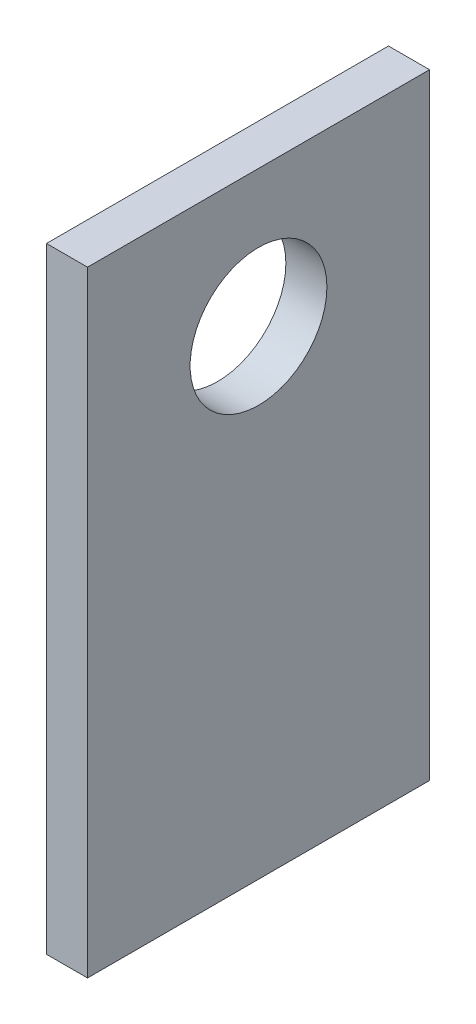
ISO-10303-21;
HEADER;
FILE_DESCRIPTION(('STEP AP214'),'2;1');
FILE_NAME('part.step','',(''),(''),'','','');
FILE_SCHEMA(('AUTOMOTIVE_DESIGN { 1 0 10303 214 1 1 1 1 }'));
ENDSEC;
DATA;
#1=APPLICATION_CONTEXT('core data for automotive mechanical design processes');
#2=APPLICATION_PROTOCOL_DEFINITION('international standard','automotive_design',2000,#1);
#3=PRODUCT_CONTEXT('',#1,'mechanical');
#4=PRODUCT('Part','Part','',(#3));
#5=PRODUCT_RELATED_PRODUCT_CATEGORY('part','',(#4));
#6=PRODUCT_DEFINITION_FORMATION('','',#4);
#7=PRODUCT_DEFINITION_CONTEXT('part definition',#1,'design');
#8=PRODUCT_DEFINITION('design','',#6,#7);
#9=PRODUCT_DEFINITION_SHAPE('','',#8);
#10=(LENGTH_UNIT() NAMED_UNIT(*) SI_UNIT(.MILLI.,.METRE.));
#11=(NAMED_UNIT(*) PLANE_ANGLE_UNIT() SI_UNIT($,.RADIAN.));
#12=(NAMED_UNIT(*) SI_UNIT($,.STERADIAN.) SOLID_ANGLE_UNIT());
#13=UNCERTAINTY_MEASURE_WITH_UNIT(LENGTH_MEASURE(1.E-05),#10,'distance_accuracy_value','');
#14=(GEOMETRIC_REPRESENTATION_CONTEXT(3) GLOBAL_UNCERTAINTY_ASSIGNED_CONTEXT((#13)) GLOBAL_UNIT_ASSIGNED_CONTEXT((#10,
#11,#12)) REPRESENTATION_CONTEXT('',''));
#15=CARTESIAN_POINT('',(0.,0.,0.));
#16=DIRECTION('',(0.,0.,1.));
#17=DIRECTION('',(1.,0.,0.));
#18=AXIS2_PLACEMENT_3D('',#15,#16,#17);
#19=CARTESIAN_POINT('',(3.,-22.5,-12.5));
#20=DIRECTION('',(0.,0.,1.));
#21=DIRECTION('',(1.,0.,0.));
#22=AXIS2_PLACEMENT_3D('',#19,#20,#21);
#23=PLANE('',#22);
#24=DIRECTION('',(0.,1.,0.));
#25=VECTOR('',#24,1.);
#26=CARTESIAN_POINT('',(0.,-22.5,-12.5));
#27=LINE('',#26,#25);
#28=CARTESIAN_POINT('',(0.,-22.5,-12.5));
#29=VERTEX_POINT('',#28);
#30=CARTESIAN_POINT('',(0.,22.5,-12.5));
#31=VERTEX_POINT('',#30);
#32=EDGE_CURVE('E97',#29,#31,#27,.T.);
#33=ORIENTED_EDGE('',*,*,#32,.T.);
#34=DIRECTION('',(-1.,0.,0.));
#35=VECTOR('',#34,1.);
#36=CARTESIAN_POINT('',(3.,22.5,-12.5));
#37=LINE('',#36,#35);
#38=CARTESIAN_POINT('',(3.,22.5,-12.5));
#39=VERTEX_POINT('',#38);
#40=EDGE_CURVE('E11',#39,#31,#37,.T.);
#41=ORIENTED_EDGE('',*,*,#40,.F.);
#42=DIRECTION('',(0.,1.,0.));
#43=VECTOR('',#42,1.);
#44=CARTESIAN_POINT('',(3.,-22.5,-12.5));
#45=LINE('',#44,#43);
#46=CARTESIAN_POINT('',(3.,-22.5,-12.5));
#47=VERTEX_POINT('',#46);
#48=EDGE_CURVE('E85',#47,#39,#45,.T.);
#49=ORIENTED_EDGE('',*,*,#48,.F.);
#50=DIRECTION('',(-1.,0.,0.));
#51=VECTOR('',#50,1.);
#52=CARTESIAN_POINT('',(3.,-22.5,-12.5));
#53=LINE('',#52,#51);
#54=EDGE_CURVE('E93',#47,#29,#53,.T.);
#55=ORIENTED_EDGE('',*,*,#54,.T.);
#56=EDGE_LOOP('',(#33,#41,#49,#55));
#57=FACE_BOUND('',#56,.T.);
#58=ADVANCED_FACE('F34',(#57),#23,.F.);
#59=CARTESIAN_POINT('',(3.,22.5,12.5));
#60=DIRECTION('',(0.,-1.,0.));
#61=DIRECTION('',(0.,0.,-1.));
#62=AXIS2_PLACEMENT_3D('',#59,#60,#61);
#63=PLANE('',#62);
#64=DIRECTION('',(0.,0.,1.));
#65=VECTOR('',#64,1.);
#66=CARTESIAN_POINT('',(0.,22.5,12.5));
#67=LINE('',#66,#65);
#68=CARTESIAN_POINT('',(0.,22.5,12.5));
#69=VERTEX_POINT('',#68);
#70=EDGE_CURVE('E89',#31,#69,#67,.T.);
#71=ORIENTED_EDGE('',*,*,#70,.T.);
#72=DIRECTION('',(-1.,0.,0.));
#73=VECTOR('',#72,1.);
#74=CARTESIAN_POINT('',(3.,22.5,12.5));
#75=LINE('',#74,#73);
#76=CARTESIAN_POINT('',(3.,22.5,12.5));
#77=VERTEX_POINT('',#76);
#78=EDGE_CURVE('E42',#77,#69,#75,.T.);
#79=ORIENTED_EDGE('',*,*,#78,.F.);
#80=DIRECTION('',(0.,0.,1.));
#81=VECTOR('',#80,1.);
#82=CARTESIAN_POINT('',(3.,22.5,12.5));
#83=LINE('',#82,#81);
#84=EDGE_CURVE('E80',#39,#77,#83,.T.);
#85=ORIENTED_EDGE('',*,*,#84,.F.);
#86=ORIENTED_EDGE('',*,*,#40,.T.);
#87=EDGE_LOOP('',(#71,#79,#85,#86));
#88=FACE_BOUND('',#87,.T.);
#89=ADVANCED_FACE('F88',(#88),#63,.F.);
#90=CARTESIAN_POINT('',(3.,-22.5,12.5));
#91=DIRECTION('',(0.,0.,-1.));
#92=DIRECTION('',(0.,1.,0.));
#93=AXIS2_PLACEMENT_3D('',#90,#91,#92);
#94=PLANE('',#93);
#95=DIRECTION('',(0.,-1.,0.));
#96=VECTOR('',#95,1.);
#97=CARTESIAN_POINT('',(0.,-22.5,12.5));
#98=LINE('',#97,#96);
#99=CARTESIAN_POINT('',(0.,-22.5,12.5));
#100=VERTEX_POINT('',#99);
#101=EDGE_CURVE('E67',#69,#100,#98,.T.);
#102=ORIENTED_EDGE('',*,*,#101,.T.);
#103=DIRECTION('',(-1.,0.,0.));
#104=VECTOR('',#103,1.);
#105=CARTESIAN_POINT('',(3.,-22.5,12.5));
#106=LINE('',#105,#104);
#107=CARTESIAN_POINT('',(3.,-22.5,12.5));
#108=VERTEX_POINT('',#107);
#109=EDGE_CURVE('E90',#108,#100,#106,.T.);
#110=ORIENTED_EDGE('',*,*,#109,.F.);
#111=DIRECTION('',(0.,-1.,0.));
#112=VECTOR('',#111,1.);
#113=CARTESIAN_POINT('',(3.,-22.5,12.5));
#114=LINE('',#113,#112);
#115=EDGE_CURVE('E83',#77,#108,#114,.T.);
#116=ORIENTED_EDGE('',*,*,#115,.F.);
#117=ORIENTED_EDGE('',*,*,#78,.T.);
#118=EDGE_LOOP('',(#102,#110,#116,#117));
#119=FACE_BOUND('',#118,.T.);
#120=ADVANCED_FACE('F91',(#119),#94,.F.);
#121=CARTESIAN_POINT('',(3.,-22.5,12.5));
#122=DIRECTION('',(0.,1.,0.));
#123=DIRECTION('',(0.,0.,1.));
#124=AXIS2_PLACEMENT_3D('',#121,#122,#123);
#125=PLANE('',#124);
#126=DIRECTION('',(0.,0.,-1.));
#127=VECTOR('',#126,1.);
#128=CARTESIAN_POINT('',(0.,-22.5,12.5));
#129=LINE('',#128,#127);
#130=EDGE_CURVE('E73',#100,#29,#129,.T.);
#131=ORIENTED_EDGE('',*,*,#130,.T.);
#132=ORIENTED_EDGE('',*,*,#54,.F.);
#133=DIRECTION('',(0.,0.,-1.));
#134=VECTOR('',#133,1.);
#135=CARTESIAN_POINT('',(3.,-22.5,12.5));
#136=LINE('',#135,#134);
#137=EDGE_CURVE('E50',#108,#47,#136,.T.);
#138=ORIENTED_EDGE('',*,*,#137,.F.);
#139=ORIENTED_EDGE('',*,*,#109,.T.);
#140=EDGE_LOOP('',(#131,#132,#138,#139));
#141=FACE_BOUND('',#140,.T.);
#142=ADVANCED_FACE('F105',(#141),#125,.F.);
#143=CARTESIAN_POINT('',(3.,0.,0.));
#144=DIRECTION('',(-1.,0.,0.));
#145=DIRECTION('',(0.,0.,1.));
#146=AXIS2_PLACEMENT_3D('',#143,#144,#145);
#147=PLANE('',#146);
#148=CARTESIAN_POINT('',(3.,12.5,0.));
#149=DIRECTION('',(1.,0.,0.));
#150=DIRECTION('',(0.,0.,-1.));
#151=AXIS2_PLACEMENT_3D('',#148,#149,#150);
#152=CIRCLE('',#151,5.);
#153=CARTESIAN_POINT('',(3.,12.5,-5.));
#154=VERTEX_POINT('',#153);
#155=EDGE_CURVE('E111',#154,#154,#152,.T.);
#156=ORIENTED_EDGE('',*,*,#155,.F.);
#157=EDGE_LOOP('',(#156));
#158=FACE_BOUND('',#157,.T.);
#159=ORIENTED_EDGE('',*,*,#48,.T.);
#160=ORIENTED_EDGE('',*,*,#84,.T.);
#161=ORIENTED_EDGE('',*,*,#115,.T.);
#162=ORIENTED_EDGE('',*,*,#137,.T.);
#163=EDGE_LOOP('',(#159,#160,#161,#162));
#164=FACE_BOUND('',#163,.T.);
#165=ADVANCED_FACE('F81',(#158,#164),#147,.F.);
#166=CARTESIAN_POINT('',(0.,0.,0.));
#167=DIRECTION('',(-1.,0.,0.));
#168=DIRECTION('',(0.,0.,1.));
#169=AXIS2_PLACEMENT_3D('',#166,#167,#168);
#170=PLANE('',#169);
#171=CARTESIAN_POINT('',(0.,12.5,0.));
#172=DIRECTION('',(1.,0.,0.));
#173=DIRECTION('',(0.,0.,-1.));
#174=AXIS2_PLACEMENT_3D('',#171,#172,#173);
#175=CIRCLE('',#174,5.);
#176=CARTESIAN_POINT('',(0.,12.5,-5.));
#177=VERTEX_POINT('',#176);
#178=EDGE_CURVE('E100',#177,#177,#175,.T.);
#179=ORIENTED_EDGE('',*,*,#178,.T.);
#180=EDGE_LOOP('',(#179));
#181=FACE_BOUND('',#180,.T.);
#182=ORIENTED_EDGE('',*,*,#32,.F.);
#183=ORIENTED_EDGE('',*,*,#130,.F.);
#184=ORIENTED_EDGE('',*,*,#101,.F.);
#185=ORIENTED_EDGE('',*,*,#70,.F.);
#186=EDGE_LOOP('',(#182,#183,#184,#185));
#187=FACE_BOUND('',#186,.T.);
#188=ADVANCED_FACE('F108',(#181,#187),#170,.T.);
#189=CARTESIAN_POINT('',(0.,12.5,0.));
#190=DIRECTION('',(1.,0.,0.));
#191=DIRECTION('',(0.,0.,-1.));
#192=AXIS2_PLACEMENT_3D('',#189,#190,#191);
#193=CYLINDRICAL_SURFACE('',#192,5.);
#194=ORIENTED_EDGE('',*,*,#178,.F.);
#195=EDGE_LOOP('',(#194));
#196=FACE_BOUND('',#195,.T.);
#197=ORIENTED_EDGE('',*,*,#155,.T.);
#198=EDGE_LOOP('',(#197));
#199=FACE_BOUND('',#198,.T.);
#200=ADVANCED_FACE('F118',(#196,#199),#193,.F.);
#201=CLOSED_SHELL('',(#58,#89,#120,#142,#165,#188,#200));
#202=MANIFOLD_SOLID_BREP('B2',#201);
#203=ADVANCED_BREP_SHAPE_REPRESENTATION('',(#18,#202),#14);
#204=SHAPE_DEFINITION_REPRESENTATION(#9,#203);
ENDSEC;
END-ISO-10303-21;
